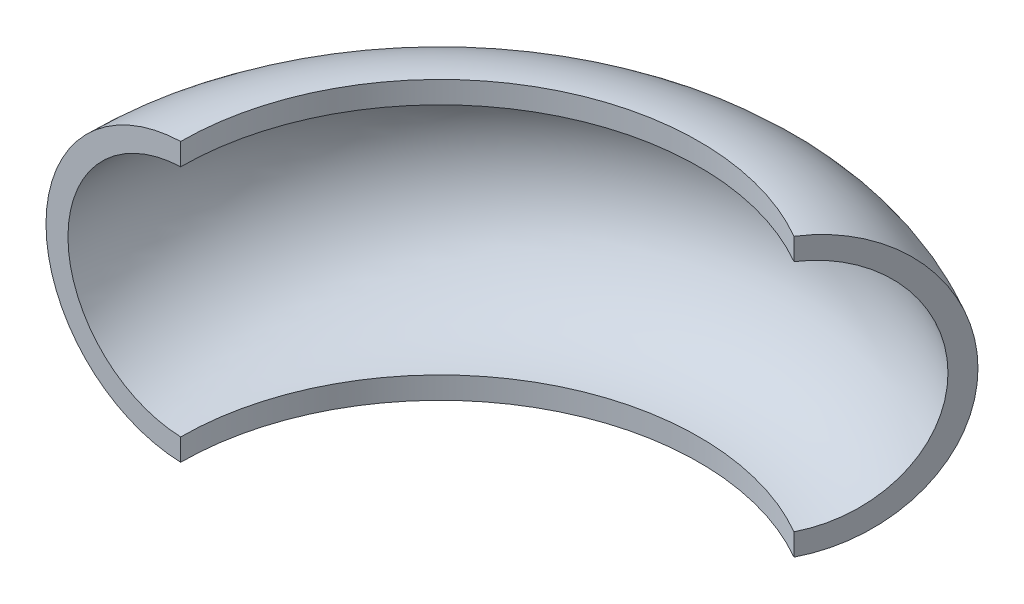
ISO-10303-21;
HEADER;
FILE_DESCRIPTION(('STEP AP214'),'2;1');
FILE_NAME('part.step','',(''),(''),'','','');
FILE_SCHEMA(('AUTOMOTIVE_DESIGN { 1 0 10303 214 1 1 1 1 }'));
ENDSEC;
DATA;
#1=APPLICATION_CONTEXT('core data for automotive mechanical design processes');
#2=APPLICATION_PROTOCOL_DEFINITION('international standard','automotive_design',2000,#1);
#3=PRODUCT_CONTEXT('',#1,'mechanical');
#4=PRODUCT('Part','Part','',(#3));
#5=PRODUCT_RELATED_PRODUCT_CATEGORY('part','',(#4));
#6=PRODUCT_DEFINITION_FORMATION('','',#4);
#7=PRODUCT_DEFINITION_CONTEXT('part definition',#1,'design');
#8=PRODUCT_DEFINITION('design','',#6,#7);
#9=PRODUCT_DEFINITION_SHAPE('','',#8);
#10=(LENGTH_UNIT() NAMED_UNIT(*) SI_UNIT(.MILLI.,.METRE.));
#11=(NAMED_UNIT(*) PLANE_ANGLE_UNIT() SI_UNIT($,.RADIAN.));
#12=(NAMED_UNIT(*) SI_UNIT($,.STERADIAN.) SOLID_ANGLE_UNIT());
#13=UNCERTAINTY_MEASURE_WITH_UNIT(LENGTH_MEASURE(1.E-05),#10,'distance_accuracy_value','');
#14=(GEOMETRIC_REPRESENTATION_CONTEXT(3) GLOBAL_UNCERTAINTY_ASSIGNED_CONTEXT((#13)) GLOBAL_UNIT_ASSIGNED_CONTEXT((#10,
#11,#12)) REPRESENTATION_CONTEXT('',''));
#15=CARTESIAN_POINT('',(0.,0.,0.));
#16=DIRECTION('',(0.,0.,1.));
#17=DIRECTION('',(1.,0.,0.));
#18=AXIS2_PLACEMENT_3D('',#15,#16,#17);
#19=CARTESIAN_POINT('',(44.2949999999999,0.,-25.5737301737545));
#20=DIRECTION('',(-0.86602540378444,0.,-0.499999999999998));
#21=DIRECTION('',(-0.499999999999998,0.,0.86602540378444));
#22=AXIS2_PLACEMENT_3D('',#19,#20,#21);
#23=PLANE('',#22);
#24=CARTESIAN_POINT('',(44.2949999999999,0.,-25.5737301737545));
#25=DIRECTION('',(-0.86602540378444,0.,-0.499999999999998));
#26=DIRECTION('',(-0.499999999999998,0.,0.86602540378444));
#27=AXIS2_PLACEMENT_3D('',#24,#25,#26);
#28=CIRCLE('',#27,16.105);
#29=CARTESIAN_POINT('',(44.5449999999999,16.0972365640814,-26.0067428756467));
#30=VERTEX_POINT('',#29);
#31=CARTESIAN_POINT('',(44.5449999999999,-16.0972365640814,-26.0067428756467));
#32=VERTEX_POINT('',#31);
#33=EDGE_CURVE('E82',#30,#32,#28,.T.);
#34=ORIENTED_EDGE('',*,*,#33,.F.);
#35=DIRECTION('',(0.,1.,0.));
#36=VECTOR('',#35,1.);
#37=CARTESIAN_POINT('',(44.5449999999999,16.0972365640814,-26.0067428756467));
#38=LINE('',#37,#36);
#39=CARTESIAN_POINT('',(44.5449999999999,13.5507785754177,-26.0067428756467));
#40=VERTEX_POINT('',#39);
#41=EDGE_CURVE('E70',#40,#30,#38,.T.);
#42=ORIENTED_EDGE('',*,*,#41,.F.);
#43=CARTESIAN_POINT('',(44.2949999999999,0.,-25.5737301737545));
#44=DIRECTION('',(0.86602540378444,0.,0.499999999999998));
#45=DIRECTION('',(-0.499999999999998,0.,0.86602540378444));
#46=AXIS2_PLACEMENT_3D('',#43,#44,#45);
#47=CIRCLE('',#46,13.56);
#48=CARTESIAN_POINT('',(44.5449999999999,-13.5507785754177,-26.0067428756467));
#49=VERTEX_POINT('',#48);
#50=EDGE_CURVE('E75',#49,#40,#47,.T.);
#51=ORIENTED_EDGE('',*,*,#50,.F.);
#52=DIRECTION('',(0.,1.,0.));
#53=VECTOR('',#52,1.);
#54=CARTESIAN_POINT('',(44.5449999999999,-13.5507785754177,-26.0067428756467));
#55=LINE('',#54,#53);
#56=EDGE_CURVE('E79',#32,#49,#55,.T.);
#57=ORIENTED_EDGE('',*,*,#56,.F.);
#58=EDGE_LOOP('',(#34,#42,#51,#57));
#59=FACE_BOUND('',#58,.T.);
#60=ADVANCED_FACE('F39',(#59),#23,.F.);
#61=CARTESIAN_POINT('',(0.,0.,0.));
#62=DIRECTION('',(0.,0.,1.));
#63=DIRECTION('',(1.,0.,0.));
#64=AXIS2_PLACEMENT_3D('',#61,#62,#63);
#65=PLANE('',#64);
#66=CARTESIAN_POINT('',(0.,0.,0.));
#67=DIRECTION('',(0.,0.,1.));
#68=DIRECTION('',(1.,0.,0.));
#69=AXIS2_PLACEMENT_3D('',#66,#67,#68);
#70=CIRCLE('',#69,16.105);
#71=CARTESIAN_POINT('',(-0.499999999999997,16.0972365640814,0.));
#72=VERTEX_POINT('',#71);
#73=CARTESIAN_POINT('',(-0.499999999999997,-16.0972365640814,0.));
#74=VERTEX_POINT('',#73);
#75=EDGE_CURVE('E98',#72,#74,#70,.T.);
#76=ORIENTED_EDGE('',*,*,#75,.T.);
#77=DIRECTION('',(0.,1.,0.));
#78=VECTOR('',#77,1.);
#79=CARTESIAN_POINT('',(-0.499999999999996,-13.5507785754177,0.));
#80=LINE('',#79,#78);
#81=CARTESIAN_POINT('',(-0.499999999999994,-13.5507785754177,0.));
#82=VERTEX_POINT('',#81);
#83=EDGE_CURVE('E59',#74,#82,#80,.T.);
#84=ORIENTED_EDGE('',*,*,#83,.T.);
#85=CARTESIAN_POINT('',(0.,0.,0.));
#86=DIRECTION('',(0.,0.,-1.));
#87=DIRECTION('',(1.,0.,0.));
#88=AXIS2_PLACEMENT_3D('',#85,#86,#87);
#89=CIRCLE('',#88,13.56);
#90=CARTESIAN_POINT('',(-0.499999999999997,13.5507785754177,0.));
#91=VERTEX_POINT('',#90);
#92=EDGE_CURVE('E53',#82,#91,#89,.T.);
#93=ORIENTED_EDGE('',*,*,#92,.T.);
#94=DIRECTION('',(0.,1.,0.));
#95=VECTOR('',#94,1.);
#96=CARTESIAN_POINT('',(-0.499999999999996,16.0972365640814,0.));
#97=LINE('',#96,#95);
#98=EDGE_CURVE('E11',#91,#72,#97,.T.);
#99=ORIENTED_EDGE('',*,*,#98,.T.);
#100=EDGE_LOOP('',(#76,#84,#93,#99));
#101=FACE_BOUND('',#100,.T.);
#102=ADVANCED_FACE('F132',(#101),#65,.T.);
#103=CARTESIAN_POINT('',(29.53,0.,0.));
#104=DIRECTION('',(0.,1.,0.));
#105=DIRECTION('',(0.,0.,1.));
#106=AXIS2_PLACEMENT_3D('',#103,#104,#105);
#107=TOROIDAL_SURFACE('',#106,29.53,16.105);
#108=CARTESIAN_POINT('',(29.53,-16.0972365640814,0.));
#109=DIRECTION('',(0.,1.,0.));
#110=DIRECTION('',(0.499999999999998,0.,-0.86602540378444));
#111=AXIS2_PLACEMENT_3D('',#108,#109,#110);
#112=CIRCLE('',#111,30.03);
#113=EDGE_CURVE('E102',#32,#74,#112,.T.);
#114=ORIENTED_EDGE('',*,*,#113,.T.);
#115=ORIENTED_EDGE('',*,*,#75,.F.);
#116=CARTESIAN_POINT('',(29.53,16.0972365640814,0.));
#117=DIRECTION('',(0.,1.,0.));
#118=DIRECTION('',(0.499999999999998,0.,-0.86602540378444));
#119=AXIS2_PLACEMENT_3D('',#116,#117,#118);
#120=CIRCLE('',#119,30.03);
#121=EDGE_CURVE('E93',#30,#72,#120,.T.);
#122=ORIENTED_EDGE('',*,*,#121,.F.);
#123=ORIENTED_EDGE('',*,*,#33,.T.);
#124=EDGE_LOOP('',(#114,#115,#122,#123));
#125=FACE_BOUND('',#124,.T.);
#126=ADVANCED_FACE('F97',(#125),#107,.T.);
#127=CARTESIAN_POINT('',(29.53,0.,0.));
#128=DIRECTION('',(0.,1.,0.));
#129=DIRECTION('',(0.,0.,1.));
#130=AXIS2_PLACEMENT_3D('',#127,#128,#129);
#131=CYLINDRICAL_SURFACE('',#130,30.03);
#132=CARTESIAN_POINT('',(29.53,-13.5507785754177,0.));
#133=DIRECTION('',(0.,1.,0.));
#134=DIRECTION('',(0.499999999999998,0.,-0.86602540378444));
#135=AXIS2_PLACEMENT_3D('',#132,#133,#134);
#136=CIRCLE('',#135,30.03);
#137=EDGE_CURVE('E110',#49,#82,#136,.T.);
#138=ORIENTED_EDGE('',*,*,#137,.T.);
#139=ORIENTED_EDGE('',*,*,#83,.F.);
#140=ORIENTED_EDGE('',*,*,#113,.F.);
#141=ORIENTED_EDGE('',*,*,#56,.T.);
#142=EDGE_LOOP('',(#138,#139,#140,#141));
#143=FACE_BOUND('',#142,.T.);
#144=ADVANCED_FACE('F123',(#143),#131,.F.);
#145=CARTESIAN_POINT('',(29.53,0.,0.));
#146=DIRECTION('',(0.,1.,0.));
#147=DIRECTION('',(0.,0.,1.));
#148=AXIS2_PLACEMENT_3D('',#145,#146,#147);
#149=TOROIDAL_SURFACE('',#148,29.53,13.56);
#150=CARTESIAN_POINT('',(29.53,13.5507785754177,0.));
#151=DIRECTION('',(0.,1.,0.));
#152=DIRECTION('',(0.499999999999998,0.,-0.86602540378444));
#153=AXIS2_PLACEMENT_3D('',#150,#151,#152);
#154=CIRCLE('',#153,30.03);
#155=EDGE_CURVE('E47',#40,#91,#154,.T.);
#156=ORIENTED_EDGE('',*,*,#155,.T.);
#157=ORIENTED_EDGE('',*,*,#92,.F.);
#158=ORIENTED_EDGE('',*,*,#137,.F.);
#159=ORIENTED_EDGE('',*,*,#50,.T.);
#160=EDGE_LOOP('',(#156,#157,#158,#159));
#161=FACE_BOUND('',#160,.T.);
#162=ADVANCED_FACE('F120',(#161),#149,.F.);
#163=CARTESIAN_POINT('',(29.53,0.,0.));
#164=DIRECTION('',(0.,1.,0.));
#165=DIRECTION('',(0.,0.,1.));
#166=AXIS2_PLACEMENT_3D('',#163,#164,#165);
#167=CYLINDRICAL_SURFACE('',#166,30.03);
#168=ORIENTED_EDGE('',*,*,#98,.F.);
#169=ORIENTED_EDGE('',*,*,#155,.F.);
#170=ORIENTED_EDGE('',*,*,#41,.T.);
#171=ORIENTED_EDGE('',*,*,#121,.T.);
#172=EDGE_LOOP('',(#168,#169,#170,#171));
#173=FACE_BOUND('',#172,.T.);
#174=ADVANCED_FACE('F92',(#173),#167,.F.);
#175=CLOSED_SHELL('',(#60,#102,#126,#144,#162,#174));
#176=MANIFOLD_SOLID_BREP('B2',#175);
#177=ADVANCED_BREP_SHAPE_REPRESENTATION('',(#18,#176),#14);
#178=SHAPE_DEFINITION_REPRESENTATION(#9,#177);
ENDSEC;
END-ISO-10303-21;
